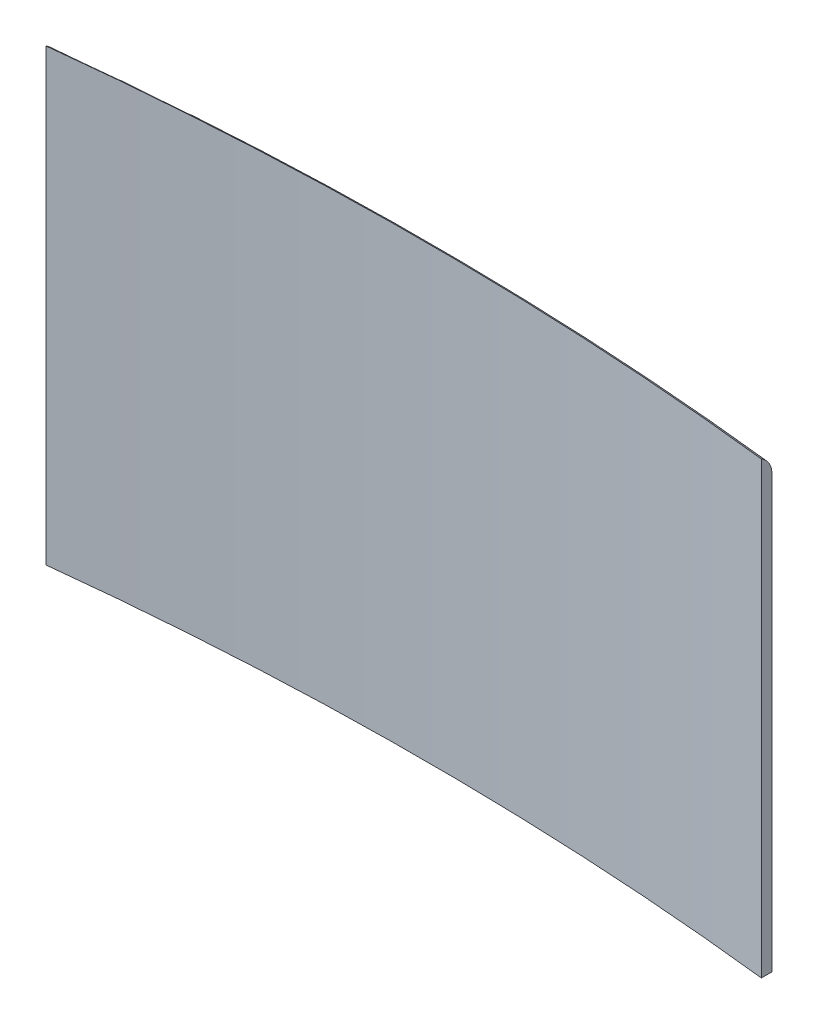
ISO-10303-21;
HEADER;
FILE_DESCRIPTION(('STEP AP214'),'2;1');
FILE_NAME('part.step','',(''),(''),'','','');
FILE_SCHEMA(('AUTOMOTIVE_DESIGN { 1 0 10303 214 1 1 1 1 }'));
ENDSEC;
DATA;
#1=APPLICATION_CONTEXT('core data for automotive mechanical design processes');
#2=APPLICATION_PROTOCOL_DEFINITION('international standard','automotive_design',2000,#1);
#3=PRODUCT_CONTEXT('',#1,'mechanical');
#4=PRODUCT('Part','Part','',(#3));
#5=PRODUCT_RELATED_PRODUCT_CATEGORY('part','',(#4));
#6=PRODUCT_DEFINITION_FORMATION('','',#4);
#7=PRODUCT_DEFINITION_CONTEXT('part definition',#1,'design');
#8=PRODUCT_DEFINITION('design','',#6,#7);
#9=PRODUCT_DEFINITION_SHAPE('','',#8);
#10=(LENGTH_UNIT() NAMED_UNIT(*) SI_UNIT(.MILLI.,.METRE.));
#11=(NAMED_UNIT(*) PLANE_ANGLE_UNIT() SI_UNIT($,.RADIAN.));
#12=(NAMED_UNIT(*) SI_UNIT($,.STERADIAN.) SOLID_ANGLE_UNIT());
#13=UNCERTAINTY_MEASURE_WITH_UNIT(LENGTH_MEASURE(1.E-05),#10,'distance_accuracy_value','');
#14=(GEOMETRIC_REPRESENTATION_CONTEXT(3) GLOBAL_UNCERTAINTY_ASSIGNED_CONTEXT((#13)) GLOBAL_UNIT_ASSIGNED_CONTEXT((#10,
#11,#12)) REPRESENTATION_CONTEXT('',''));
#15=CARTESIAN_POINT('',(0.,0.,0.));
#16=DIRECTION('',(0.,0.,1.));
#17=DIRECTION('',(1.,0.,0.));
#18=AXIS2_PLACEMENT_3D('',#15,#16,#17);
#19=CARTESIAN_POINT('',(-34.,42.73,302.092701004179));
#20=DIRECTION('',(0.,-1.,0.));
#21=DIRECTION('',(0.,0.,-1.));
#22=AXIS2_PLACEMENT_3D('',#19,#20,#21);
#23=CYLINDRICAL_SURFACE('',#22,304.);
#24=CARTESIAN_POINT('',(-34.,0.,302.092701004179));
#25=DIRECTION('',(0.,-1.,0.));
#26=DIRECTION('',(0.,0.,1.));
#27=AXIS2_PLACEMENT_3D('',#24,#25,#26);
#28=CIRCLE('',#27,304.);
#29=CARTESIAN_POINT('',(-68.,0.,0.));
#30=VERTEX_POINT('',#29);
#31=CARTESIAN_POINT('',(0.,0.,0.));
#32=VERTEX_POINT('',#31);
#33=EDGE_CURVE('E93',#30,#32,#28,.T.);
#34=ORIENTED_EDGE('',*,*,#33,.T.);
#35=DIRECTION('',(0.,-1.,0.));
#36=VECTOR('',#35,1.);
#37=CARTESIAN_POINT('',(0.,42.73,0.));
#38=LINE('',#37,#36);
#39=CARTESIAN_POINT('',(0.,42.73,0.));
#40=VERTEX_POINT('',#39);
#41=EDGE_CURVE('E83',#40,#32,#38,.T.);
#42=ORIENTED_EDGE('',*,*,#41,.F.);
#43=CARTESIAN_POINT('',(-34.,42.73,302.092701004179));
#44=DIRECTION('',(0.,-1.,0.));
#45=DIRECTION('',(0.,0.,1.));
#46=AXIS2_PLACEMENT_3D('',#43,#44,#45);
#47=CIRCLE('',#46,304.);
#48=CARTESIAN_POINT('',(-68.,42.73,0.));
#49=VERTEX_POINT('',#48);
#50=EDGE_CURVE('E91',#49,#40,#47,.T.);
#51=ORIENTED_EDGE('',*,*,#50,.F.);
#52=DIRECTION('',(0.,-1.,0.));
#53=VECTOR('',#52,1.);
#54=CARTESIAN_POINT('',(-68.,42.73,0.));
#55=LINE('',#54,#53);
#56=EDGE_CURVE('E95',#49,#30,#55,.T.);
#57=ORIENTED_EDGE('',*,*,#56,.T.);
#58=EDGE_LOOP('',(#34,#42,#51,#57));
#59=FACE_BOUND('',#58,.T.);
#60=ADVANCED_FACE('F35',(#59),#23,.F.);
#61=CARTESIAN_POINT('',(0.,42.73,0.));
#62=DIRECTION('',(-1.,0.,0.));
#63=DIRECTION('',(0.,0.,1.));
#64=AXIS2_PLACEMENT_3D('',#61,#62,#63);
#65=PLANE('',#64);
#66=DIRECTION('',(0.,-1.,0.));
#67=VECTOR('',#66,1.);
#68=CARTESIAN_POINT('',(0.,42.73,-1.01));
#69=LINE('',#68,#67);
#70=CARTESIAN_POINT('',(0.,40.9958273549541,-1.01));
#71=VERTEX_POINT('',#70);
#72=CARTESIAN_POINT('',(0.,0.,-1.01));
#73=VERTEX_POINT('',#72);
#74=EDGE_CURVE('E85',#71,#73,#69,.T.);
#75=ORIENTED_EDGE('',*,*,#74,.F.);
#76=CARTESIAN_POINT('',(0.,40.9958273549541,-1.01));
#77=CARTESIAN_POINT('',(0.,41.0518530769975,-1.00999978098167));
#78=CARTESIAN_POINT('',(0.,41.1078518505481,-1.00762955701045));
#79=CARTESIAN_POINT('',(0.,41.2194466125533,-0.998174998616082));
#80=CARTESIAN_POINT('',(0.,41.2750426247663,-0.991090944583404));
#81=CARTESIAN_POINT('',(0.,41.440466612414,-0.962848568229263));
#82=CARTESIAN_POINT('',(0.,41.5491838451968,-0.934699753838726));
#83=CARTESIAN_POINT('',(0.,41.7603307395298,-0.860570268201767));
#84=CARTESIAN_POINT('',(0.,41.8627584425699,-0.814584074826227));
#85=CARTESIAN_POINT('',(0.,42.0585364737153,-0.706083266412758));
#86=CARTESIAN_POINT('',(0.,42.1518822031281,-0.643560336901952));
#87=CARTESIAN_POINT('',(0.,42.3271236599442,-0.503575947443012));
#88=CARTESIAN_POINT('',(0.,42.4089771668633,-0.426061769271058));
#89=CARTESIAN_POINT('',(0.,42.5584556687341,-0.258562617406564));
#90=CARTESIAN_POINT('',(0.,42.6261105851038,-0.168604545315759));
#91=CARTESIAN_POINT('',(0.,42.701039303336,-0.0494980861129813));
#92=CARTESIAN_POINT('',(0.,42.7157903980141,-0.0248965672929635));
#93=CARTESIAN_POINT('',(0.,42.73,0.));
#94=B_SPLINE_CURVE_WITH_KNOTS('',3,(#76,#77,#78,#79,#80,#81,#82,#83,#84,#85,#86,#87,#88,#89,#90,
#91,#92,#93),.UNSPECIFIED.,.F.,.F.,(4,2,2,2,2,2,2,2,4),(0.,0.167973566031795,0.335937141466538,
0.671114073073805,1.00639485230602,1.34184452821585,1.6784960307646,2.01443080399674,
2.10045658615355),.UNSPECIFIED.);
#95=EDGE_CURVE('E11',#71,#40,#94,.T.);
#96=ORIENTED_EDGE('',*,*,#95,.T.);
#97=ORIENTED_EDGE('',*,*,#41,.T.);
#98=DIRECTION('',(0.,0.,-1.));
#99=VECTOR('',#98,1.);
#100=CARTESIAN_POINT('',(0.,0.,0.));
#101=LINE('',#100,#99);
#102=EDGE_CURVE('E104',#32,#73,#101,.T.);
#103=ORIENTED_EDGE('',*,*,#102,.T.);
#104=EDGE_LOOP('',(#75,#96,#97,#103));
#105=FACE_BOUND('',#104,.T.);
#106=ADVANCED_FACE('F81',(#105),#65,.F.);
#107=CARTESIAN_POINT('',(-34.,42.73,302.092701004179));
#108=DIRECTION('',(0.,-1.,0.));
#109=DIRECTION('',(0.,0.,-1.));
#110=AXIS2_PLACEMENT_3D('',#107,#108,#109);
#111=CYLINDRICAL_SURFACE('',#110,305.00368416796);
#112=DIRECTION('',(0.,-1.,0.));
#113=VECTOR('',#112,1.);
#114=CARTESIAN_POINT('',(-67.9999999999999,42.73,-1.01000000000001));
#115=LINE('',#114,#113);
#116=CARTESIAN_POINT('',(-67.9999999999999,40.9958273549541,-1.01000000000001));
#117=VERTEX_POINT('',#116);
#118=CARTESIAN_POINT('',(-67.9999999999999,0.,-1.01000000000001));
#119=VERTEX_POINT('',#118);
#120=EDGE_CURVE('E98',#117,#119,#115,.T.);
#121=ORIENTED_EDGE('',*,*,#120,.F.);
#122=CARTESIAN_POINT('',(-34.,40.9958273549541,302.092701004179));
#123=DIRECTION('',(0.,1.,0.));
#124=DIRECTION('',(0.,0.,1.));
#125=AXIS2_PLACEMENT_3D('',#122,#123,#124);
#126=CIRCLE('',#125,305.00368416796);
#127=EDGE_CURVE('E49',#117,#71,#126,.F.);
#128=ORIENTED_EDGE('',*,*,#127,.T.);
#129=ORIENTED_EDGE('',*,*,#74,.T.);
#130=CARTESIAN_POINT('',(-34.,0.,302.092701004179));
#131=DIRECTION('',(0.,1.,0.));
#132=DIRECTION('',(0.,0.,1.));
#133=AXIS2_PLACEMENT_3D('',#130,#131,#132);
#134=CIRCLE('',#133,305.00368416796);
#135=EDGE_CURVE('E100',#73,#119,#134,.T.);
#136=ORIENTED_EDGE('',*,*,#135,.T.);
#137=EDGE_LOOP('',(#121,#128,#129,#136));
#138=FACE_BOUND('',#137,.T.);
#139=ADVANCED_FACE('F121',(#138),#111,.T.);
#140=CARTESIAN_POINT('',(-68.,42.73,-1.01000000000001));
#141=DIRECTION('',(1.,0.,0.));
#142=DIRECTION('',(0.,0.,-1.));
#143=AXIS2_PLACEMENT_3D('',#140,#141,#142);
#144=PLANE('',#143);
#145=ORIENTED_EDGE('',*,*,#56,.F.);
#146=CARTESIAN_POINT('',(-68.,42.73,0.));
#147=CARTESIAN_POINT('',(-68.,42.7020005713435,-0.0490415400595071));
#148=CARTESIAN_POINT('',(-68.,42.6719536312042,-0.0968831269908643));
#149=CARTESIAN_POINT('',(-68.,42.6079501898347,-0.189873825130586));
#150=CARTESIAN_POINT('',(-68.,42.5739937677932,-0.235022990847313));
#151=CARTESIAN_POINT('',(-68.,42.4667110017988,-0.365783403164087));
#152=CARTESIAN_POINT('',(-68.,42.3878330114342,-0.446949105367355));
#153=CARTESIAN_POINT('',(-68.,42.2175302738431,-0.594902321861879));
#154=CARTESIAN_POINT('',(-68.,42.1260934156165,-0.661675795511007));
#155=CARTESIAN_POINT('',(-68.,41.9331910639539,-0.778874443051889));
#156=CARTESIAN_POINT('',(-68.,41.8317247692618,-0.829298309386771));
#157=CARTESIAN_POINT('',(-68.,41.6688926835263,-0.893650553717386));
#158=CARTESIAN_POINT('',(-68.,41.6099102843912,-0.913811416689478));
#159=CARTESIAN_POINT('',(-68.,41.4902924630463,-0.948527324042707));
#160=CARTESIAN_POINT('',(-68.,41.4296568348256,-0.963081666338036));
#161=CARTESIAN_POINT('',(-68.,41.3071025892848,-0.98646889041622));
#162=CARTESIAN_POINT('',(-68.,41.245180597837,-0.995284026501024));
#163=CARTESIAN_POINT('',(-68.,41.1207826889673,-1.00705401703473));
#164=CARTESIAN_POINT('',(-68.,41.0583067742214,-1.01000889977908));
#165=CARTESIAN_POINT('',(-68.,40.995827354954,-1.00999999999996));
#166=B_SPLINE_CURVE_WITH_KNOTS('',3,(#146,#147,#148,#149,#150,#151,#152,#153,#154,#155,#156,
#157,#158,#159,#160,#161,#162,#163,#164,#165),.UNSPECIFIED.,.F.,.F.,(4,2,2,2,2,2,2,2,2,4),(0.,
0.16931107225284,0.338618715619921,0.676409787081394,1.01452892095607,1.35267508918113,
1.53944013941454,1.7262285700125,1.91359184390389,2.10095421313479),.UNSPECIFIED.);
#167=EDGE_CURVE('E63',#49,#117,#166,.T.);
#168=ORIENTED_EDGE('',*,*,#167,.T.);
#169=ORIENTED_EDGE('',*,*,#120,.T.);
#170=DIRECTION('',(0.,0.,1.));
#171=VECTOR('',#170,1.);
#172=CARTESIAN_POINT('',(-68.,0.,-1.01000000000001));
#173=LINE('',#172,#171);
#174=EDGE_CURVE('E96',#119,#30,#173,.T.);
#175=ORIENTED_EDGE('',*,*,#174,.T.);
#176=EDGE_LOOP('',(#145,#168,#169,#175));
#177=FACE_BOUND('',#176,.T.);
#178=ADVANCED_FACE('F115',(#177),#144,.F.);
#179=CARTESIAN_POINT('',(-34.,0.,302.092701004179));
#180=DIRECTION('',(0.,1.,0.));
#181=DIRECTION('',(0.,0.,1.));
#182=AXIS2_PLACEMENT_3D('',#179,#180,#181);
#183=PLANE('',#182);
#184=ORIENTED_EDGE('',*,*,#33,.F.);
#185=ORIENTED_EDGE('',*,*,#174,.F.);
#186=ORIENTED_EDGE('',*,*,#135,.F.);
#187=ORIENTED_EDGE('',*,*,#102,.F.);
#188=EDGE_LOOP('',(#184,#185,#186,#187));
#189=FACE_BOUND('',#188,.T.);
#190=ADVANCED_FACE('F120',(#189),#183,.F.);
#191=CARTESIAN_POINT('',(-34.,40.9958273549541,302.092701004179));
#192=DIRECTION('',(0.,1.,0.));
#193=DIRECTION('',(0.,0.,1.));
#194=AXIS2_PLACEMENT_3D('',#191,#192,#193);
#195=TOROIDAL_SURFACE('',#194,303.00368416796,2.);
#196=ORIENTED_EDGE('',*,*,#95,.F.);
#197=ORIENTED_EDGE('',*,*,#127,.F.);
#198=ORIENTED_EDGE('',*,*,#167,.F.);
#199=ORIENTED_EDGE('',*,*,#50,.T.);
#200=EDGE_LOOP('',(#196,#197,#198,#199));
#201=FACE_BOUND('',#200,.T.);
#202=ADVANCED_FACE('F37',(#201),#195,.T.);
#203=CLOSED_SHELL('',(#60,#106,#139,#178,#190,#202));
#204=MANIFOLD_SOLID_BREP('B2',#203);
#205=ADVANCED_BREP_SHAPE_REPRESENTATION('',(#18,#204),#14);
#206=SHAPE_DEFINITION_REPRESENTATION(#9,#205);
ENDSEC;
END-ISO-10303-21;
